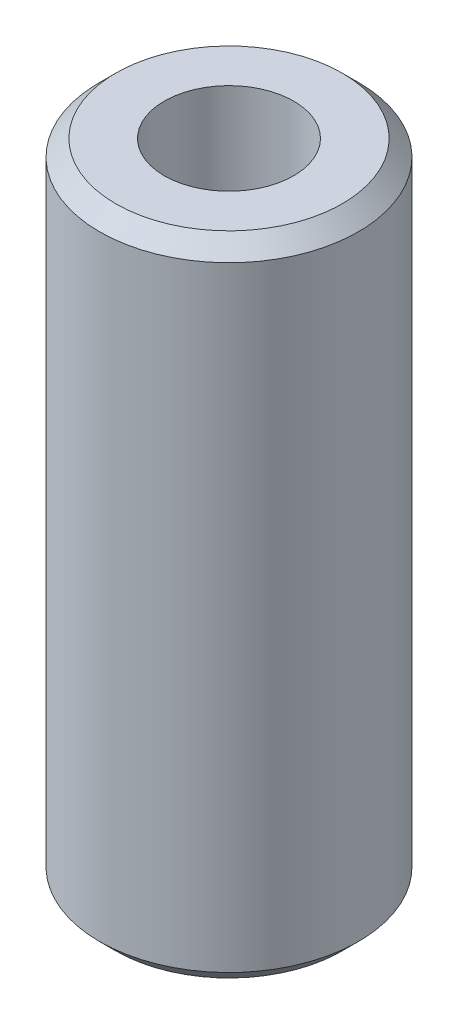
ISO-10303-21;
HEADER;
FILE_DESCRIPTION(('STEP AP214'),'2;1');
FILE_NAME('part.step','',(''),(''),'','','');
FILE_SCHEMA(('AUTOMOTIVE_DESIGN { 1 0 10303 214 1 1 1 1 }'));
ENDSEC;
DATA;
#1=APPLICATION_CONTEXT('core data for automotive mechanical design processes');
#2=APPLICATION_PROTOCOL_DEFINITION('international standard','automotive_design',2000,#1);
#3=PRODUCT_CONTEXT('',#1,'mechanical');
#4=PRODUCT('Part','Part','',(#3));
#5=PRODUCT_RELATED_PRODUCT_CATEGORY('part','',(#4));
#6=PRODUCT_DEFINITION_FORMATION('','',#4);
#7=PRODUCT_DEFINITION_CONTEXT('part definition',#1,'design');
#8=PRODUCT_DEFINITION('design','',#6,#7);
#9=PRODUCT_DEFINITION_SHAPE('','',#8);
#10=(LENGTH_UNIT() NAMED_UNIT(*) SI_UNIT(.MILLI.,.METRE.));
#11=(NAMED_UNIT(*) PLANE_ANGLE_UNIT() SI_UNIT($,.RADIAN.));
#12=(NAMED_UNIT(*) SI_UNIT($,.STERADIAN.) SOLID_ANGLE_UNIT());
#13=UNCERTAINTY_MEASURE_WITH_UNIT(LENGTH_MEASURE(1.E-05),#10,'distance_accuracy_value','');
#14=(GEOMETRIC_REPRESENTATION_CONTEXT(3) GLOBAL_UNCERTAINTY_ASSIGNED_CONTEXT((#13)) GLOBAL_UNIT_ASSIGNED_CONTEXT((#10,
#11,#12)) REPRESENTATION_CONTEXT('',''));
#15=CARTESIAN_POINT('',(0.,0.,0.));
#16=DIRECTION('',(0.,0.,1.));
#17=DIRECTION('',(1.,0.,0.));
#18=AXIS2_PLACEMENT_3D('',#15,#16,#17);
#19=CARTESIAN_POINT('',(0.,20.,0.));
#20=DIRECTION('',(0.,1.,0.));
#21=DIRECTION('',(0.,0.,1.));
#22=AXIS2_PLACEMENT_3D('',#19,#20,#21);
#23=PLANE('',#22);
#24=CARTESIAN_POINT('',(0.,20.,0.));
#25=DIRECTION('',(0.,1.,0.));
#26=DIRECTION('',(0.,0.,1.));
#27=AXIS2_PLACEMENT_3D('',#24,#25,#26);
#28=CIRCLE('',#27,3.5);
#29=CARTESIAN_POINT('',(0.,20.,3.5));
#30=VERTEX_POINT('',#29);
#31=EDGE_CURVE('E10',#30,#30,#28,.T.);
#32=ORIENTED_EDGE('',*,*,#31,.T.);
#33=EDGE_LOOP('',(#32));
#34=FACE_BOUND('',#33,.T.);
#35=CARTESIAN_POINT('',(0.,20.,0.));
#36=DIRECTION('',(0.,1.,0.));
#37=DIRECTION('',(0.,0.,1.));
#38=AXIS2_PLACEMENT_3D('',#35,#36,#37);
#39=CIRCLE('',#38,2.);
#40=CARTESIAN_POINT('',(0.,20.,2.));
#41=VERTEX_POINT('',#40);
#42=EDGE_CURVE('E58',#41,#41,#39,.T.);
#43=ORIENTED_EDGE('',*,*,#42,.F.);
#44=EDGE_LOOP('',(#43));
#45=FACE_BOUND('',#44,.T.);
#46=ADVANCED_FACE('F37',(#34,#45),#23,.T.);
#47=CARTESIAN_POINT('',(0.,0.,0.));
#48=DIRECTION('',(0.,1.,0.));
#49=DIRECTION('',(0.,0.,1.));
#50=AXIS2_PLACEMENT_3D('',#47,#48,#49);
#51=PLANE('',#50);
#52=CARTESIAN_POINT('',(0.,0.,0.));
#53=DIRECTION('',(0.,1.,0.));
#54=DIRECTION('',(0.,0.,1.));
#55=AXIS2_PLACEMENT_3D('',#52,#53,#54);
#56=CIRCLE('',#55,3.49999999999999);
#57=CARTESIAN_POINT('',(0.,0.,3.49999999999999));
#58=VERTEX_POINT('',#57);
#59=EDGE_CURVE('E45',#58,#58,#56,.F.);
#60=ORIENTED_EDGE('',*,*,#59,.T.);
#61=EDGE_LOOP('',(#60));
#62=FACE_BOUND('',#61,.T.);
#63=CARTESIAN_POINT('',(0.,0.,0.));
#64=DIRECTION('',(0.,1.,0.));
#65=DIRECTION('',(0.,0.,1.));
#66=AXIS2_PLACEMENT_3D('',#63,#64,#65);
#67=CIRCLE('',#66,2.);
#68=CARTESIAN_POINT('',(0.,0.,2.));
#69=VERTEX_POINT('',#68);
#70=EDGE_CURVE('E59',#69,#69,#67,.T.);
#71=ORIENTED_EDGE('',*,*,#70,.T.);
#72=EDGE_LOOP('',(#71));
#73=FACE_BOUND('',#72,.T.);
#74=ADVANCED_FACE('F69',(#62,#73),#51,.F.);
#75=CARTESIAN_POINT('',(0.,20.,0.));
#76=DIRECTION('',(0.,-1.,0.));
#77=DIRECTION('',(0.,0.,-1.));
#78=AXIS2_PLACEMENT_3D('',#75,#76,#77);
#79=CYLINDRICAL_SURFACE('',#78,4.);
#80=CARTESIAN_POINT('',(0.,0.500000000000011,0.));
#81=DIRECTION('',(0.,1.,0.));
#82=DIRECTION('',(0.,0.,1.));
#83=AXIS2_PLACEMENT_3D('',#80,#81,#82);
#84=CIRCLE('',#83,4.);
#85=CARTESIAN_POINT('',(0.,0.500000000000011,4.));
#86=VERTEX_POINT('',#85);
#87=EDGE_CURVE('E49',#86,#86,#84,.T.);
#88=ORIENTED_EDGE('',*,*,#87,.T.);
#89=EDGE_LOOP('',(#88));
#90=FACE_BOUND('',#89,.T.);
#91=CARTESIAN_POINT('',(0.,19.5,0.));
#92=DIRECTION('',(0.,1.,0.));
#93=DIRECTION('',(0.,0.,1.));
#94=AXIS2_PLACEMENT_3D('',#91,#92,#93);
#95=CIRCLE('',#94,4.);
#96=CARTESIAN_POINT('',(0.,19.5,4.));
#97=VERTEX_POINT('',#96);
#98=EDGE_CURVE('E53',#97,#97,#95,.F.);
#99=ORIENTED_EDGE('',*,*,#98,.T.);
#100=EDGE_LOOP('',(#99));
#101=FACE_BOUND('',#100,.T.);
#102=ADVANCED_FACE('F74',(#90,#101),#79,.T.);
#103=CARTESIAN_POINT('',(0.,20.,0.));
#104=DIRECTION('',(0.,-1.,0.));
#105=DIRECTION('',(0.,0.,-1.));
#106=AXIS2_PLACEMENT_3D('',#103,#104,#105);
#107=CYLINDRICAL_SURFACE('',#106,2.);
#108=ORIENTED_EDGE('',*,*,#42,.T.);
#109=EDGE_LOOP('',(#108));
#110=FACE_BOUND('',#109,.T.);
#111=ORIENTED_EDGE('',*,*,#70,.F.);
#112=EDGE_LOOP('',(#111));
#113=FACE_BOUND('',#112,.T.);
#114=ADVANCED_FACE('F65',(#110,#113),#107,.F.);
#115=CARTESIAN_POINT('',(0.,0.500000000000011,0.));
#116=DIRECTION('',(0.,1.,0.));
#117=DIRECTION('',(0.,0.,1.));
#118=AXIS2_PLACEMENT_3D('',#115,#116,#117);
#119=CONICAL_SURFACE('',#118,4.,0.785398163397452);
#120=ORIENTED_EDGE('',*,*,#59,.F.);
#121=EDGE_LOOP('',(#120));
#122=FACE_BOUND('',#121,.T.);
#123=ORIENTED_EDGE('',*,*,#87,.F.);
#124=EDGE_LOOP('',(#123));
#125=FACE_BOUND('',#124,.T.);
#126=ADVANCED_FACE('F81',(#122,#125),#119,.T.);
#127=CARTESIAN_POINT('',(0.,20.,0.));
#128=DIRECTION('',(0.,-1.,0.));
#129=DIRECTION('',(0.,0.,-1.));
#130=AXIS2_PLACEMENT_3D('',#127,#128,#129);
#131=CONICAL_SURFACE('',#130,3.5,0.785398163397445);
#132=ORIENTED_EDGE('',*,*,#98,.F.);
#133=EDGE_LOOP('',(#132));
#134=FACE_BOUND('',#133,.T.);
#135=ORIENTED_EDGE('',*,*,#31,.F.);
#136=EDGE_LOOP('',(#135));
#137=FACE_BOUND('',#136,.T.);
#138=ADVANCED_FACE('F40',(#134,#137),#131,.T.);
#139=CLOSED_SHELL('',(#46,#74,#102,#114,#126,#138));
#140=MANIFOLD_SOLID_BREP('B2',#139);
#141=ADVANCED_BREP_SHAPE_REPRESENTATION('',(#18,#140),#14);
#142=SHAPE_DEFINITION_REPRESENTATION(#9,#141);
ENDSEC;
END-ISO-10303-21;
